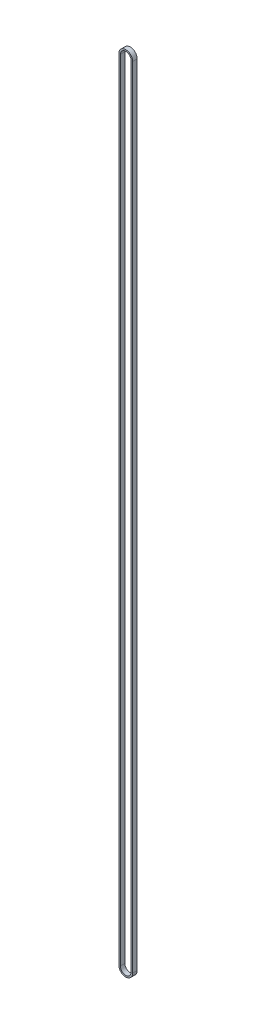
ISO-10303-21;
HEADER;
FILE_DESCRIPTION(('STEP AP214'),'2;1');
FILE_NAME('part.step','',(''),(''),'','','');
FILE_SCHEMA(('AUTOMOTIVE_DESIGN { 1 0 10303 214 1 1 1 1 }'));
ENDSEC;
DATA;
#1=APPLICATION_CONTEXT('core data for automotive mechanical design processes');
#2=APPLICATION_PROTOCOL_DEFINITION('international standard','automotive_design',2000,#1);
#3=PRODUCT_CONTEXT('',#1,'mechanical');
#4=PRODUCT('Part','Part','',(#3));
#5=PRODUCT_RELATED_PRODUCT_CATEGORY('part','',(#4));
#6=PRODUCT_DEFINITION_FORMATION('','',#4);
#7=PRODUCT_DEFINITION_CONTEXT('part definition',#1,'design');
#8=PRODUCT_DEFINITION('design','',#6,#7);
#9=PRODUCT_DEFINITION_SHAPE('','',#8);
#10=(LENGTH_UNIT() NAMED_UNIT(*) SI_UNIT(.MILLI.,.METRE.));
#11=(NAMED_UNIT(*) PLANE_ANGLE_UNIT() SI_UNIT($,.RADIAN.));
#12=(NAMED_UNIT(*) SI_UNIT($,.STERADIAN.) SOLID_ANGLE_UNIT());
#13=UNCERTAINTY_MEASURE_WITH_UNIT(LENGTH_MEASURE(1.E-05),#10,'distance_accuracy_value','');
#14=(GEOMETRIC_REPRESENTATION_CONTEXT(3) GLOBAL_UNCERTAINTY_ASSIGNED_CONTEXT((#13)) GLOBAL_UNIT_ASSIGNED_CONTEXT((#10,
#11,#12)) REPRESENTATION_CONTEXT('',''));
#15=CARTESIAN_POINT('',(0.,0.,0.));
#16=DIRECTION('',(0.,0.,1.));
#17=DIRECTION('',(1.,0.,0.));
#18=AXIS2_PLACEMENT_3D('',#15,#16,#17);
#19=CARTESIAN_POINT('',(0.,-1041.,3.));
#20=DIRECTION('',(0.,0.,-1.));
#21=DIRECTION('',(-1.,0.,0.));
#22=AXIS2_PLACEMENT_3D('',#19,#20,#21);
#23=CYLINDRICAL_SURFACE('',#22,9.11);
#24=CARTESIAN_POINT('',(0.,-1041.,-3.));
#25=DIRECTION('',(0.,0.,-1.));
#26=DIRECTION('',(-1.,0.,0.));
#27=AXIS2_PLACEMENT_3D('',#24,#25,#26);
#28=CIRCLE('',#27,9.11);
#29=CARTESIAN_POINT('',(9.11000000000003,-1041.,-3.));
#30=VERTEX_POINT('',#29);
#31=CARTESIAN_POINT('',(-9.10999999999997,-1041.,-3.));
#32=VERTEX_POINT('',#31);
#33=EDGE_CURVE('E159',#30,#32,#28,.T.);
#34=ORIENTED_EDGE('',*,*,#33,.F.);
#35=DIRECTION('',(0.,0.,-1.));
#36=VECTOR('',#35,1.);
#37=CARTESIAN_POINT('',(9.11000000000003,-1041.,3.));
#38=LINE('',#37,#36);
#39=CARTESIAN_POINT('',(9.11000000000003,-1041.,3.));
#40=VERTEX_POINT('',#39);
#41=EDGE_CURVE('E12',#40,#30,#38,.T.);
#42=ORIENTED_EDGE('',*,*,#41,.F.);
#43=CARTESIAN_POINT('',(0.,-1041.,3.));
#44=DIRECTION('',(0.,0.,-1.));
#45=DIRECTION('',(-1.,0.,0.));
#46=AXIS2_PLACEMENT_3D('',#43,#44,#45);
#47=CIRCLE('',#46,9.11);
#48=CARTESIAN_POINT('',(-9.10999999999997,-1041.,3.));
#49=VERTEX_POINT('',#48);
#50=EDGE_CURVE('E163',#40,#49,#47,.T.);
#51=ORIENTED_EDGE('',*,*,#50,.T.);
#52=DIRECTION('',(0.,0.,-1.));
#53=VECTOR('',#52,1.);
#54=CARTESIAN_POINT('',(-9.10999999999997,-1041.,3.));
#55=LINE('',#54,#53);
#56=EDGE_CURVE('E64',#49,#32,#55,.T.);
#57=ORIENTED_EDGE('',*,*,#56,.T.);
#58=EDGE_LOOP('',(#34,#42,#51,#57));
#59=FACE_BOUND('',#58,.T.);
#60=ADVANCED_FACE('F61',(#59),#23,.T.);
#61=CARTESIAN_POINT('',(9.11000000000003,-1041.,3.));
#62=DIRECTION('',(1.,0.,0.));
#63=DIRECTION('',(0.,1.,0.));
#64=AXIS2_PLACEMENT_3D('',#61,#62,#63);
#65=PLANE('',#64);
#66=DIRECTION('',(0.,-1.,0.));
#67=VECTOR('',#66,1.);
#68=CARTESIAN_POINT('',(9.11000000000003,-1041.,-3.));
#69=LINE('',#68,#67);
#70=CARTESIAN_POINT('',(9.11000000000003,3.3418256062157E-13,-3.));
#71=VERTEX_POINT('',#70);
#72=EDGE_CURVE('E167',#71,#30,#69,.T.);
#73=ORIENTED_EDGE('',*,*,#72,.F.);
#74=DIRECTION('',(0.,0.,-1.));
#75=VECTOR('',#74,1.);
#76=CARTESIAN_POINT('',(9.11000000000003,3.3418256062157E-13,3.));
#77=LINE('',#76,#75);
#78=CARTESIAN_POINT('',(9.11000000000003,3.3418256062157E-13,3.));
#79=VERTEX_POINT('',#78);
#80=EDGE_CURVE('E69',#79,#71,#77,.T.);
#81=ORIENTED_EDGE('',*,*,#80,.F.);
#82=DIRECTION('',(0.,-1.,0.));
#83=VECTOR('',#82,1.);
#84=CARTESIAN_POINT('',(9.11000000000003,-1041.,3.));
#85=LINE('',#84,#83);
#86=EDGE_CURVE('E173',#79,#40,#85,.T.);
#87=ORIENTED_EDGE('',*,*,#86,.T.);
#88=ORIENTED_EDGE('',*,*,#41,.T.);
#89=EDGE_LOOP('',(#73,#81,#87,#88));
#90=FACE_BOUND('',#89,.T.);
#91=ADVANCED_FACE('F199',(#90),#65,.T.);
#92=CARTESIAN_POINT('',(0.,3.33066907387547E-13,3.));
#93=DIRECTION('',(0.,0.,-1.));
#94=DIRECTION('',(-1.,0.,0.));
#95=AXIS2_PLACEMENT_3D('',#92,#93,#94);
#96=CYLINDRICAL_SURFACE('',#95,9.11);
#97=CARTESIAN_POINT('',(0.,3.33066907387547E-13,-3.));
#98=DIRECTION('',(0.,0.,-1.));
#99=DIRECTION('',(-1.,0.,0.));
#100=AXIS2_PLACEMENT_3D('',#97,#98,#99);
#101=CIRCLE('',#100,9.11);
#102=CARTESIAN_POINT('',(-9.10999999999997,4.44089209850063E-13,-3.));
#103=VERTEX_POINT('',#102);
#104=EDGE_CURVE('E181',#103,#71,#101,.T.);
#105=ORIENTED_EDGE('',*,*,#104,.F.);
#106=DIRECTION('',(0.,0.,-1.));
#107=VECTOR('',#106,1.);
#108=CARTESIAN_POINT('',(-9.10999999999997,4.44089209850063E-13,3.));
#109=LINE('',#108,#107);
#110=CARTESIAN_POINT('',(-9.10999999999997,4.44089209850063E-13,3.));
#111=VERTEX_POINT('',#110);
#112=EDGE_CURVE('E186',#111,#103,#109,.T.);
#113=ORIENTED_EDGE('',*,*,#112,.F.);
#114=CARTESIAN_POINT('',(0.,3.33066907387547E-13,3.));
#115=DIRECTION('',(0.,0.,-1.));
#116=DIRECTION('',(-1.,0.,0.));
#117=AXIS2_PLACEMENT_3D('',#114,#115,#116);
#118=CIRCLE('',#117,9.11);
#119=EDGE_CURVE('E170',#111,#79,#118,.T.);
#120=ORIENTED_EDGE('',*,*,#119,.T.);
#121=ORIENTED_EDGE('',*,*,#80,.T.);
#122=EDGE_LOOP('',(#105,#113,#120,#121));
#123=FACE_BOUND('',#122,.T.);
#124=ADVANCED_FACE('F203',(#123),#96,.T.);
#125=CARTESIAN_POINT('',(-9.10999999999997,-1041.,3.));
#126=DIRECTION('',(-1.,0.,0.));
#127=DIRECTION('',(0.,-1.,0.));
#128=AXIS2_PLACEMENT_3D('',#125,#126,#127);
#129=PLANE('',#128);
#130=DIRECTION('',(0.,1.,0.));
#131=VECTOR('',#130,1.);
#132=CARTESIAN_POINT('',(-9.10999999999997,-1041.,-3.));
#133=LINE('',#132,#131);
#134=EDGE_CURVE('E178',#32,#103,#133,.T.);
#135=ORIENTED_EDGE('',*,*,#134,.F.);
#136=ORIENTED_EDGE('',*,*,#56,.F.);
#137=DIRECTION('',(0.,1.,0.));
#138=VECTOR('',#137,1.);
#139=CARTESIAN_POINT('',(-9.10999999999997,-1041.,3.));
#140=LINE('',#139,#138);
#141=EDGE_CURVE('E166',#49,#111,#140,.T.);
#142=ORIENTED_EDGE('',*,*,#141,.T.);
#143=ORIENTED_EDGE('',*,*,#112,.T.);
#144=EDGE_LOOP('',(#135,#136,#142,#143));
#145=FACE_BOUND('',#144,.T.);
#146=ADVANCED_FACE('F194',(#145),#129,.T.);
#147=CARTESIAN_POINT('',(0.,-1041.,3.));
#148=DIRECTION('',(0.,0.,-1.));
#149=DIRECTION('',(-1.,0.,0.));
#150=AXIS2_PLACEMENT_3D('',#147,#148,#149);
#151=PLANE('',#150);
#152=DIRECTION('',(0.,-1.,0.));
#153=VECTOR('',#152,1.);
#154=CARTESIAN_POINT('',(7.11000000000003,3.33019514942151E-13,3.));
#155=LINE('',#154,#153);
#156=CARTESIAN_POINT('',(7.11000000000003,3.33937631261741E-13,3.));
#157=VERTEX_POINT('',#156);
#158=CARTESIAN_POINT('',(7.11000000000003,-1041.,3.));
#159=VERTEX_POINT('',#158);
#160=EDGE_CURVE('E134',#157,#159,#155,.T.);
#161=ORIENTED_EDGE('',*,*,#160,.T.);
#162=CARTESIAN_POINT('',(0.,-1041.,3.));
#163=DIRECTION('',(0.,0.,-1.));
#164=DIRECTION('',(-1.,0.,0.));
#165=AXIS2_PLACEMENT_3D('',#162,#163,#164);
#166=CIRCLE('',#165,7.11);
#167=CARTESIAN_POINT('',(-7.10999999999997,-1041.,3.));
#168=VERTEX_POINT('',#167);
#169=EDGE_CURVE('E128',#159,#168,#166,.T.);
#170=ORIENTED_EDGE('',*,*,#169,.T.);
#171=DIRECTION('',(0.,1.,0.));
#172=VECTOR('',#171,1.);
#173=CARTESIAN_POINT('',(-7.10999999999997,-1041.,3.));
#174=LINE('',#173,#172);
#175=CARTESIAN_POINT('',(-7.10999999999997,4.44089209850063E-13,3.));
#176=VERTEX_POINT('',#175);
#177=EDGE_CURVE('E137',#168,#176,#174,.T.);
#178=ORIENTED_EDGE('',*,*,#177,.T.);
#179=CARTESIAN_POINT('',(0.,3.33066907387547E-13,3.));
#180=DIRECTION('',(0.,0.,-1.));
#181=DIRECTION('',(-1.,0.,0.));
#182=AXIS2_PLACEMENT_3D('',#179,#180,#181);
#183=CIRCLE('',#182,7.11);
#184=EDGE_CURVE('E77',#176,#157,#183,.T.);
#185=ORIENTED_EDGE('',*,*,#184,.T.);
#186=EDGE_LOOP('',(#161,#170,#178,#185));
#187=FACE_BOUND('',#186,.T.);
#188=ORIENTED_EDGE('',*,*,#50,.F.);
#189=ORIENTED_EDGE('',*,*,#86,.F.);
#190=ORIENTED_EDGE('',*,*,#119,.F.);
#191=ORIENTED_EDGE('',*,*,#141,.F.);
#192=EDGE_LOOP('',(#188,#189,#190,#191));
#193=FACE_BOUND('',#192,.T.);
#194=ADVANCED_FACE('F141',(#187,#193),#151,.F.);
#195=CARTESIAN_POINT('',(0.,-1041.,-3.));
#196=DIRECTION('',(0.,0.,-1.));
#197=DIRECTION('',(-1.,0.,0.));
#198=AXIS2_PLACEMENT_3D('',#195,#196,#197);
#199=PLANE('',#198);
#200=CARTESIAN_POINT('',(0.,-1041.,-3.));
#201=DIRECTION('',(0.,0.,-1.));
#202=DIRECTION('',(-1.,0.,0.));
#203=AXIS2_PLACEMENT_3D('',#200,#201,#202);
#204=CIRCLE('',#203,7.11);
#205=CARTESIAN_POINT('',(7.11000000000003,-1041.,-3.));
#206=VERTEX_POINT('',#205);
#207=CARTESIAN_POINT('',(-7.10999999999997,-1041.,-3.));
#208=VERTEX_POINT('',#207);
#209=EDGE_CURVE('E85',#206,#208,#204,.T.);
#210=ORIENTED_EDGE('',*,*,#209,.F.);
#211=DIRECTION('',(0.,-1.,0.));
#212=VECTOR('',#211,1.);
#213=CARTESIAN_POINT('',(7.11000000000003,3.33019514942151E-13,-3.));
#214=LINE('',#213,#212);
#215=CARTESIAN_POINT('',(7.11000000000003,3.33937631261741E-13,-3.));
#216=VERTEX_POINT('',#215);
#217=EDGE_CURVE('E144',#216,#206,#214,.T.);
#218=ORIENTED_EDGE('',*,*,#217,.F.);
#219=CARTESIAN_POINT('',(0.,3.33066907387547E-13,-3.));
#220=DIRECTION('',(0.,0.,-1.));
#221=DIRECTION('',(-1.,0.,0.));
#222=AXIS2_PLACEMENT_3D('',#219,#220,#221);
#223=CIRCLE('',#222,7.11);
#224=CARTESIAN_POINT('',(-7.10999999999997,3.33114299832943E-13,-3.));
#225=VERTEX_POINT('',#224);
#226=EDGE_CURVE('E147',#225,#216,#223,.T.);
#227=ORIENTED_EDGE('',*,*,#226,.F.);
#228=DIRECTION('',(0.,1.,0.));
#229=VECTOR('',#228,1.);
#230=CARTESIAN_POINT('',(-7.10999999999997,-1041.,-3.));
#231=LINE('',#230,#229);
#232=EDGE_CURVE('E153',#208,#225,#231,.T.);
#233=ORIENTED_EDGE('',*,*,#232,.F.);
#234=EDGE_LOOP('',(#210,#218,#227,#233));
#235=FACE_BOUND('',#234,.T.);
#236=ORIENTED_EDGE('',*,*,#33,.T.);
#237=ORIENTED_EDGE('',*,*,#134,.T.);
#238=ORIENTED_EDGE('',*,*,#104,.T.);
#239=ORIENTED_EDGE('',*,*,#72,.T.);
#240=EDGE_LOOP('',(#236,#237,#238,#239));
#241=FACE_BOUND('',#240,.T.);
#242=ADVANCED_FACE('F196',(#235,#241),#199,.T.);
#243=CARTESIAN_POINT('',(0.,-1041.,3.));
#244=DIRECTION('',(0.,0.,-1.));
#245=DIRECTION('',(-1.,0.,0.));
#246=AXIS2_PLACEMENT_3D('',#243,#244,#245);
#247=CYLINDRICAL_SURFACE('',#246,7.11);
#248=ORIENTED_EDGE('',*,*,#209,.T.);
#249=DIRECTION('',(0.,0.,-1.));
#250=VECTOR('',#249,1.);
#251=CARTESIAN_POINT('',(-7.10999999999997,-1041.,3.));
#252=LINE('',#251,#250);
#253=EDGE_CURVE('E124',#168,#208,#252,.T.);
#254=ORIENTED_EDGE('',*,*,#253,.F.);
#255=ORIENTED_EDGE('',*,*,#169,.F.);
#256=DIRECTION('',(0.,0.,-1.));
#257=VECTOR('',#256,1.);
#258=CARTESIAN_POINT('',(7.11000000000003,-1041.,3.));
#259=LINE('',#258,#257);
#260=EDGE_CURVE('E157',#159,#206,#259,.T.);
#261=ORIENTED_EDGE('',*,*,#260,.T.);
#262=EDGE_LOOP('',(#248,#254,#255,#261));
#263=FACE_BOUND('',#262,.T.);
#264=ADVANCED_FACE('F126',(#263),#247,.F.);
#265=CARTESIAN_POINT('',(7.11000000000003,3.33019514942151E-13,3.));
#266=DIRECTION('',(1.,0.,0.));
#267=DIRECTION('',(0.,1.,0.));
#268=AXIS2_PLACEMENT_3D('',#265,#266,#267);
#269=PLANE('',#268);
#270=ORIENTED_EDGE('',*,*,#217,.T.);
#271=ORIENTED_EDGE('',*,*,#260,.F.);
#272=ORIENTED_EDGE('',*,*,#160,.F.);
#273=DIRECTION('',(0.,0.,-1.));
#274=VECTOR('',#273,1.);
#275=CARTESIAN_POINT('',(7.11000000000003,3.33937631261741E-13,3.));
#276=LINE('',#275,#274);
#277=EDGE_CURVE('E160',#157,#216,#276,.T.);
#278=ORIENTED_EDGE('',*,*,#277,.T.);
#279=EDGE_LOOP('',(#270,#271,#272,#278));
#280=FACE_BOUND('',#279,.T.);
#281=ADVANCED_FACE('F259',(#280),#269,.F.);
#282=CARTESIAN_POINT('',(0.,3.33066907387547E-13,3.));
#283=DIRECTION('',(0.,0.,-1.));
#284=DIRECTION('',(-1.,0.,0.));
#285=AXIS2_PLACEMENT_3D('',#282,#283,#284);
#286=CYLINDRICAL_SURFACE('',#285,7.11);
#287=ORIENTED_EDGE('',*,*,#226,.T.);
#288=ORIENTED_EDGE('',*,*,#277,.F.);
#289=ORIENTED_EDGE('',*,*,#184,.F.);
#290=DIRECTION('',(0.,0.,-1.));
#291=VECTOR('',#290,1.);
#292=CARTESIAN_POINT('',(-7.10999999999997,3.33114299832943E-13,3.));
#293=LINE('',#292,#291);
#294=EDGE_CURVE('E133',#176,#225,#293,.T.);
#295=ORIENTED_EDGE('',*,*,#294,.T.);
#296=EDGE_LOOP('',(#287,#288,#289,#295));
#297=FACE_BOUND('',#296,.T.);
#298=ADVANCED_FACE('F269',(#297),#286,.F.);
#299=CARTESIAN_POINT('',(-7.10999999999997,-1041.,3.));
#300=DIRECTION('',(-1.,0.,0.));
#301=DIRECTION('',(0.,-1.,0.));
#302=AXIS2_PLACEMENT_3D('',#299,#300,#301);
#303=PLANE('',#302);
#304=ORIENTED_EDGE('',*,*,#232,.T.);
#305=ORIENTED_EDGE('',*,*,#294,.F.);
#306=ORIENTED_EDGE('',*,*,#177,.F.);
#307=ORIENTED_EDGE('',*,*,#253,.T.);
#308=EDGE_LOOP('',(#304,#305,#306,#307));
#309=FACE_BOUND('',#308,.T.);
#310=ADVANCED_FACE('F138',(#309),#303,.F.);
#311=CLOSED_SHELL('',(#60,#91,#124,#146,#194,#242,#264,#281,#298,#310));
#312=MANIFOLD_SOLID_BREP('B2',#311);
#313=ADVANCED_BREP_SHAPE_REPRESENTATION('',(#18,#312),#14);
#314=SHAPE_DEFINITION_REPRESENTATION(#9,#313);
ENDSEC;
END-ISO-10303-21;
